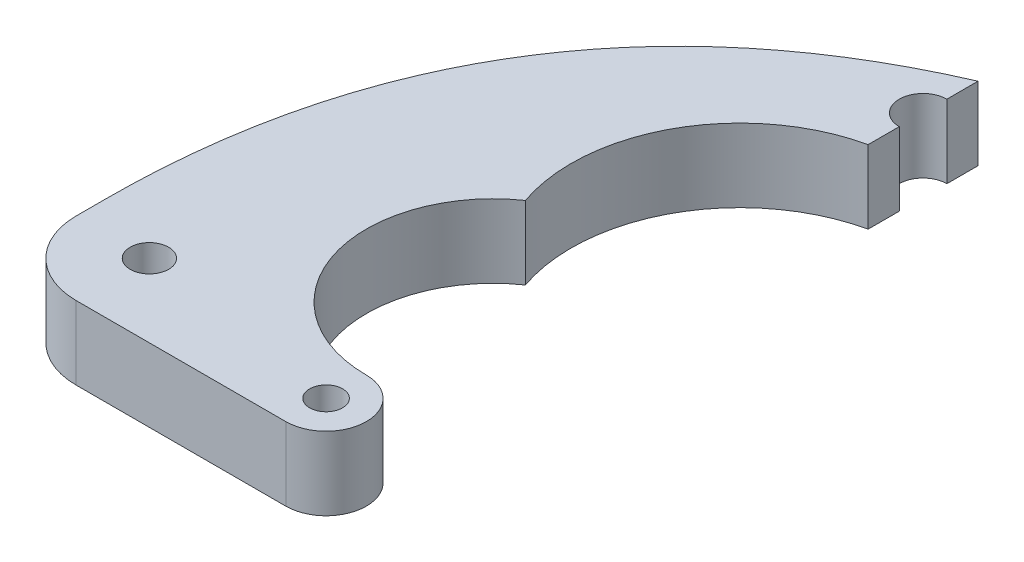
ISO-10303-21;
HEADER;
FILE_DESCRIPTION(('STEP AP214'),'2;1');
FILE_NAME('part.step','',(''),(''),'','','');
FILE_SCHEMA(('AUTOMOTIVE_DESIGN { 1 0 10303 214 1 1 1 1 }'));
ENDSEC;
DATA;
#1=APPLICATION_CONTEXT('core data for automotive mechanical design processes');
#2=APPLICATION_PROTOCOL_DEFINITION('international standard','automotive_design',2000,#1);
#3=PRODUCT_CONTEXT('',#1,'mechanical');
#4=PRODUCT('Part','Part','',(#3));
#5=PRODUCT_RELATED_PRODUCT_CATEGORY('part','',(#4));
#6=PRODUCT_DEFINITION_FORMATION('','',#4);
#7=PRODUCT_DEFINITION_CONTEXT('part definition',#1,'design');
#8=PRODUCT_DEFINITION('design','',#6,#7);
#9=PRODUCT_DEFINITION_SHAPE('','',#8);
#10=(LENGTH_UNIT() NAMED_UNIT(*) SI_UNIT(.MILLI.,.METRE.));
#11=(NAMED_UNIT(*) PLANE_ANGLE_UNIT() SI_UNIT($,.RADIAN.));
#12=(NAMED_UNIT(*) SI_UNIT($,.STERADIAN.) SOLID_ANGLE_UNIT());
#13=UNCERTAINTY_MEASURE_WITH_UNIT(LENGTH_MEASURE(1.E-05),#10,'distance_accuracy_value','');
#14=(GEOMETRIC_REPRESENTATION_CONTEXT(3) GLOBAL_UNCERTAINTY_ASSIGNED_CONTEXT((#13)) GLOBAL_UNIT_ASSIGNED_CONTEXT((#10,
#11,#12)) REPRESENTATION_CONTEXT('',''));
#15=CARTESIAN_POINT('',(0.,0.,0.));
#16=DIRECTION('',(0.,0.,1.));
#17=DIRECTION('',(1.,0.,0.));
#18=AXIS2_PLACEMENT_3D('',#15,#16,#17);
#19=CARTESIAN_POINT('',(0.,4.,-50.));
#20=DIRECTION('',(0.,1.,0.));
#21=DIRECTION('',(0.,0.,1.));
#22=AXIS2_PLACEMENT_3D('',#19,#20,#21);
#23=PLANE('',#22);
#24=CARTESIAN_POINT('',(-2.8,4.,-20.2));
#25=DIRECTION('',(0.,1.,0.));
#26=DIRECTION('',(0.,0.,1.));
#27=AXIS2_PLACEMENT_3D('',#24,#25,#26);
#28=CIRCLE('',#27,0.900000000000002);
#29=CARTESIAN_POINT('',(-2.8,4.,-19.3));
#30=VERTEX_POINT('',#29);
#31=EDGE_CURVE('E147',#30,#30,#28,.T.);
#32=ORIENTED_EDGE('',*,*,#31,.F.);
#33=EDGE_LOOP('',(#32));
#34=FACE_BOUND('',#33,.T.);
#35=CARTESIAN_POINT('',(0.,4.,-50.));
#36=DIRECTION('',(0.,-1.,0.));
#37=DIRECTION('',(0.,0.,1.));
#38=AXIS2_PLACEMENT_3D('',#35,#36,#37);
#39=CIRCLE('',#38,1.3);
#40=CARTESIAN_POINT('',(0.,4.,-48.7));
#41=VERTEX_POINT('',#40);
#42=CARTESIAN_POINT('',(0.,4.,-51.3));
#43=VERTEX_POINT('',#42);
#44=EDGE_CURVE('E167',#41,#43,#39,.T.);
#45=ORIENTED_EDGE('',*,*,#44,.T.);
#46=DIRECTION('',(0.,0.,-1.));
#47=VECTOR('',#46,1.);
#48=CARTESIAN_POINT('',(0.,4.,-51.3));
#49=LINE('',#48,#47);
#50=CARTESIAN_POINT('',(0.,4.,-53.));
#51=VERTEX_POINT('',#50);
#52=EDGE_CURVE('E100',#43,#51,#49,.T.);
#53=ORIENTED_EDGE('',*,*,#52,.T.);
#54=CARTESIAN_POINT('',(0.,4.,-53.));
#55=CARTESIAN_POINT('',(-11.2885860039401,4.,-48.1070694457853));
#56=CARTESIAN_POINT('',(-18.25,4.,-38.6912666099154));
#57=CARTESIAN_POINT('',(-18.25,4.,-23.6));
#58=B_SPLINE_CURVE_WITH_KNOTS('',3,(#54,#55,#56,#57),.UNSPECIFIED.,.F.,.F.,(4,4),(0.,1.),.UNSPECIFIED.);
#59=CARTESIAN_POINT('',(-18.25,4.,-23.6));
#60=VERTEX_POINT('',#59);
#61=EDGE_CURVE('E188',#51,#60,#58,.T.);
#62=ORIENTED_EDGE('',*,*,#61,.T.);
#63=DIRECTION('',(0.,0.,1.));
#64=VECTOR('',#63,1.);
#65=CARTESIAN_POINT('',(-18.25,4.,-23.6));
#66=LINE('',#65,#64);
#67=CARTESIAN_POINT('',(-18.25,4.,-22.));
#68=VERTEX_POINT('',#67);
#69=EDGE_CURVE('E207',#60,#68,#66,.T.);
#70=ORIENTED_EDGE('',*,*,#69,.T.);
#71=CARTESIAN_POINT('',(-14.25,4.,-22.));
#72=DIRECTION('',(0.,1.,0.));
#73=DIRECTION('',(0.,0.,1.));
#74=AXIS2_PLACEMENT_3D('',#71,#72,#73);
#75=CIRCLE('',#74,4.);
#76=CARTESIAN_POINT('',(-14.25,4.,-18.));
#77=VERTEX_POINT('',#76);
#78=EDGE_CURVE('E204',#68,#77,#75,.T.);
#79=ORIENTED_EDGE('',*,*,#78,.T.);
#80=DIRECTION('',(1.,0.,0.));
#81=VECTOR('',#80,1.);
#82=CARTESIAN_POINT('',(-14.25,4.,-18.));
#83=LINE('',#82,#81);
#84=CARTESIAN_POINT('',(-2.8,4.,-18.));
#85=VERTEX_POINT('',#84);
#86=EDGE_CURVE('E206',#77,#85,#83,.T.);
#87=ORIENTED_EDGE('',*,*,#86,.T.);
#88=CARTESIAN_POINT('',(-2.8,4.,-20.2));
#89=DIRECTION('',(0.,1.,0.));
#90=DIRECTION('',(0.,0.,1.));
#91=AXIS2_PLACEMENT_3D('',#88,#89,#90);
#92=CIRCLE('',#91,2.2);
#93=CARTESIAN_POINT('',(-2.8,4.,-22.4));
#94=VERTEX_POINT('',#93);
#95=EDGE_CURVE('E125',#85,#94,#92,.T.);
#96=ORIENTED_EDGE('',*,*,#95,.T.);
#97=CARTESIAN_POINT('',(-2.8,4.,-29.3090928684135));
#98=DIRECTION('',(0.,-1.,0.));
#99=DIRECTION('',(0.,0.,1.));
#100=AXIS2_PLACEMENT_3D('',#97,#98,#99);
#101=CIRCLE('',#100,6.90909286841346);
#102=CARTESIAN_POINT('',(-6.71779788708135,4.,-35.));
#103=VERTEX_POINT('',#102);
#104=EDGE_CURVE('E119',#94,#103,#101,.T.);
#105=ORIENTED_EDGE('',*,*,#104,.T.);
#106=CARTESIAN_POINT('',(2.,4.,-38.));
#107=DIRECTION('',(0.,-1.,0.));
#108=DIRECTION('',(0.,0.,1.));
#109=AXIS2_PLACEMENT_3D('',#106,#107,#108);
#110=CIRCLE('',#109,9.21954445729289);
#111=CARTESIAN_POINT('',(0.,4.,-47.));
#112=VERTEX_POINT('',#111);
#113=EDGE_CURVE('E123',#103,#112,#110,.T.);
#114=ORIENTED_EDGE('',*,*,#113,.T.);
#115=DIRECTION('',(0.,0.,-1.));
#116=VECTOR('',#115,1.);
#117=CARTESIAN_POINT('',(0.,4.,-47.));
#118=LINE('',#117,#116);
#119=EDGE_CURVE('E51',#112,#41,#118,.T.);
#120=ORIENTED_EDGE('',*,*,#119,.T.);
#121=EDGE_LOOP('',(#45,#53,#62,#70,#79,#87,#96,#105,#114,#120));
#122=FACE_BOUND('',#121,.T.);
#123=CARTESIAN_POINT('',(-14.25,4.,-22.));
#124=DIRECTION('',(0.,1.,0.));
#125=DIRECTION('',(0.,0.,1.));
#126=AXIS2_PLACEMENT_3D('',#123,#124,#125);
#127=CIRCLE('',#126,1.05);
#128=CARTESIAN_POINT('',(-14.25,4.,-20.95));
#129=VERTEX_POINT('',#128);
#130=EDGE_CURVE('E346',#129,#129,#127,.T.);
#131=ORIENTED_EDGE('',*,*,#130,.F.);
#132=EDGE_LOOP('',(#131));
#133=FACE_BOUND('',#132,.T.);
#134=ADVANCED_FACE('F34',(#34,#122,#133),#23,.T.);
#135=CARTESIAN_POINT('',(0.,0.,-50.));
#136=DIRECTION('',(0.,1.,0.));
#137=DIRECTION('',(0.,0.,1.));
#138=AXIS2_PLACEMENT_3D('',#135,#136,#137);
#139=PLANE('',#138);
#140=CARTESIAN_POINT('',(0.,0.,-50.));
#141=DIRECTION('',(0.,-1.,0.));
#142=DIRECTION('',(0.,0.,1.));
#143=AXIS2_PLACEMENT_3D('',#140,#141,#142);
#144=CIRCLE('',#143,1.3);
#145=CARTESIAN_POINT('',(0.,0.,-48.7));
#146=VERTEX_POINT('',#145);
#147=CARTESIAN_POINT('',(0.,0.,-51.3));
#148=VERTEX_POINT('',#147);
#149=EDGE_CURVE('E143',#146,#148,#144,.T.);
#150=ORIENTED_EDGE('',*,*,#149,.F.);
#151=DIRECTION('',(0.,0.,-1.));
#152=VECTOR('',#151,1.);
#153=CARTESIAN_POINT('',(0.,0.,-47.));
#154=LINE('',#153,#152);
#155=CARTESIAN_POINT('',(0.,0.,-47.));
#156=VERTEX_POINT('',#155);
#157=EDGE_CURVE('E92',#156,#146,#154,.T.);
#158=ORIENTED_EDGE('',*,*,#157,.F.);
#159=CARTESIAN_POINT('',(2.,0.,-38.));
#160=DIRECTION('',(0.,-1.,0.));
#161=DIRECTION('',(0.,0.,1.));
#162=AXIS2_PLACEMENT_3D('',#159,#160,#161);
#163=CIRCLE('',#162,9.21954445729289);
#164=CARTESIAN_POINT('',(-6.71779788708135,0.,-35.));
#165=VERTEX_POINT('',#164);
#166=EDGE_CURVE('E86',#165,#156,#163,.T.);
#167=ORIENTED_EDGE('',*,*,#166,.F.);
#168=CARTESIAN_POINT('',(-2.8,0.,-29.3090928684135));
#169=DIRECTION('',(0.,-1.,0.));
#170=DIRECTION('',(0.,0.,1.));
#171=AXIS2_PLACEMENT_3D('',#168,#169,#170);
#172=CIRCLE('',#171,6.90909286841346);
#173=CARTESIAN_POINT('',(-2.8,0.,-22.4));
#174=VERTEX_POINT('',#173);
#175=EDGE_CURVE('E133',#174,#165,#172,.T.);
#176=ORIENTED_EDGE('',*,*,#175,.F.);
#177=CARTESIAN_POINT('',(-2.8,0.,-20.2));
#178=DIRECTION('',(0.,1.,0.));
#179=DIRECTION('',(0.,0.,1.));
#180=AXIS2_PLACEMENT_3D('',#177,#178,#179);
#181=CIRCLE('',#180,2.2);
#182=CARTESIAN_POINT('',(-2.8,0.,-18.));
#183=VERTEX_POINT('',#182);
#184=EDGE_CURVE('E162',#183,#174,#181,.T.);
#185=ORIENTED_EDGE('',*,*,#184,.F.);
#186=DIRECTION('',(1.,0.,0.));
#187=VECTOR('',#186,1.);
#188=CARTESIAN_POINT('',(-14.25,0.,-18.));
#189=LINE('',#188,#187);
#190=CARTESIAN_POINT('',(-14.25,0.,-18.));
#191=VERTEX_POINT('',#190);
#192=EDGE_CURVE('E160',#191,#183,#189,.T.);
#193=ORIENTED_EDGE('',*,*,#192,.F.);
#194=CARTESIAN_POINT('',(-14.25,0.,-22.));
#195=DIRECTION('',(0.,1.,0.));
#196=DIRECTION('',(0.,0.,1.));
#197=AXIS2_PLACEMENT_3D('',#194,#195,#196);
#198=CIRCLE('',#197,4.);
#199=CARTESIAN_POINT('',(-18.25,0.,-22.));
#200=VERTEX_POINT('',#199);
#201=EDGE_CURVE('E158',#200,#191,#198,.T.);
#202=ORIENTED_EDGE('',*,*,#201,.F.);
#203=DIRECTION('',(0.,0.,1.));
#204=VECTOR('',#203,1.);
#205=CARTESIAN_POINT('',(-18.25,0.,-23.6));
#206=LINE('',#205,#204);
#207=CARTESIAN_POINT('',(-18.25,0.,-23.6));
#208=VERTEX_POINT('',#207);
#209=EDGE_CURVE('E153',#208,#200,#206,.T.);
#210=ORIENTED_EDGE('',*,*,#209,.F.);
#211=CARTESIAN_POINT('',(0.,0.,-53.));
#212=CARTESIAN_POINT('',(-11.2885860039401,0.,-48.1070694457853));
#213=CARTESIAN_POINT('',(-18.25,0.,-38.6912666099154));
#214=CARTESIAN_POINT('',(-18.25,0.,-23.6));
#215=B_SPLINE_CURVE_WITH_KNOTS('',3,(#211,#212,#213,#214),.UNSPECIFIED.,.F.,.F.,(4,4),(0.,1.),.UNSPECIFIED.);
#216=CARTESIAN_POINT('',(0.,0.,-53.));
#217=VERTEX_POINT('',#216);
#218=EDGE_CURVE('E149',#217,#208,#215,.T.);
#219=ORIENTED_EDGE('',*,*,#218,.F.);
#220=DIRECTION('',(0.,0.,-1.));
#221=VECTOR('',#220,1.);
#222=CARTESIAN_POINT('',(0.,0.,-51.3));
#223=LINE('',#222,#221);
#224=EDGE_CURVE('E146',#148,#217,#223,.T.);
#225=ORIENTED_EDGE('',*,*,#224,.F.);
#226=EDGE_LOOP('',(#150,#158,#167,#176,#185,#193,#202,#210,#219,#225));
#227=FACE_BOUND('',#226,.T.);
#228=CARTESIAN_POINT('',(-2.8,0.,-20.2));
#229=DIRECTION('',(0.,1.,0.));
#230=DIRECTION('',(0.,0.,1.));
#231=AXIS2_PLACEMENT_3D('',#228,#229,#230);
#232=CIRCLE('',#231,0.900000000000002);
#233=CARTESIAN_POINT('',(-2.8,0.,-19.3));
#234=VERTEX_POINT('',#233);
#235=EDGE_CURVE('E352',#234,#234,#232,.T.);
#236=ORIENTED_EDGE('',*,*,#235,.T.);
#237=EDGE_LOOP('',(#236));
#238=FACE_BOUND('',#237,.T.);
#239=CARTESIAN_POINT('',(-14.25,0.,-22.));
#240=DIRECTION('',(0.,1.,0.));
#241=DIRECTION('',(0.,0.,1.));
#242=AXIS2_PLACEMENT_3D('',#239,#240,#241);
#243=CIRCLE('',#242,1.05);
#244=CARTESIAN_POINT('',(-14.25,0.,-20.95));
#245=VERTEX_POINT('',#244);
#246=EDGE_CURVE('E349',#245,#245,#243,.T.);
#247=ORIENTED_EDGE('',*,*,#246,.T.);
#248=EDGE_LOOP('',(#247));
#249=FACE_BOUND('',#248,.T.);
#250=ADVANCED_FACE('F192',(#227,#238,#249),#139,.F.);
#251=CARTESIAN_POINT('',(0.,4.,-50.));
#252=DIRECTION('',(0.,-1.,0.));
#253=DIRECTION('',(0.,0.,-1.));
#254=AXIS2_PLACEMENT_3D('',#251,#252,#253);
#255=CYLINDRICAL_SURFACE('',#254,1.3);
#256=ORIENTED_EDGE('',*,*,#149,.T.);
#257=DIRECTION('',(0.,-1.,0.));
#258=VECTOR('',#257,1.);
#259=CARTESIAN_POINT('',(0.,4.,-51.3));
#260=LINE('',#259,#258);
#261=EDGE_CURVE('E11',#43,#148,#260,.T.);
#262=ORIENTED_EDGE('',*,*,#261,.F.);
#263=ORIENTED_EDGE('',*,*,#44,.F.);
#264=DIRECTION('',(0.,-1.,0.));
#265=VECTOR('',#264,1.);
#266=CARTESIAN_POINT('',(0.,4.,-48.7));
#267=LINE('',#266,#265);
#268=EDGE_CURVE('E139',#41,#146,#267,.T.);
#269=ORIENTED_EDGE('',*,*,#268,.T.);
#270=EDGE_LOOP('',(#256,#262,#263,#269));
#271=FACE_BOUND('',#270,.T.);
#272=ADVANCED_FACE('F36',(#271),#255,.F.);
#273=CARTESIAN_POINT('',(0.,4.,-51.3));
#274=DIRECTION('',(-1.,0.,0.));
#275=DIRECTION('',(0.,0.,1.));
#276=AXIS2_PLACEMENT_3D('',#273,#274,#275);
#277=PLANE('',#276);
#278=ORIENTED_EDGE('',*,*,#224,.T.);
#279=DIRECTION('',(0.,-1.,0.));
#280=VECTOR('',#279,1.);
#281=CARTESIAN_POINT('',(0.,4.,-53.));
#282=LINE('',#281,#280);
#283=EDGE_CURVE('E43',#51,#217,#282,.T.);
#284=ORIENTED_EDGE('',*,*,#283,.F.);
#285=ORIENTED_EDGE('',*,*,#52,.F.);
#286=ORIENTED_EDGE('',*,*,#261,.T.);
#287=EDGE_LOOP('',(#278,#284,#285,#286));
#288=FACE_BOUND('',#287,.T.);
#289=ADVANCED_FACE('F223',(#288),#277,.F.);
#290=DIRECTION('',(0.,-1.,0.));
#291=VECTOR('',#290,1.);
#292=SURFACE_OF_LINEAR_EXTRUSION('',#58,#291);
#293=ORIENTED_EDGE('',*,*,#218,.T.);
#294=DIRECTION('',(0.,-1.,0.));
#295=VECTOR('',#294,1.);
#296=CARTESIAN_POINT('',(-18.25,4.,-23.6));
#297=LINE('',#296,#295);
#298=EDGE_CURVE('E180',#60,#208,#297,.T.);
#299=ORIENTED_EDGE('',*,*,#298,.F.);
#300=ORIENTED_EDGE('',*,*,#61,.F.);
#301=ORIENTED_EDGE('',*,*,#283,.T.);
#302=EDGE_LOOP('',(#293,#299,#300,#301));
#303=FACE_BOUND('',#302,.T.);
#304=ADVANCED_FACE('F186',(#303),#292,.F.);
#305=CARTESIAN_POINT('',(-18.25,4.,-23.6));
#306=DIRECTION('',(1.,0.,0.));
#307=DIRECTION('',(0.,0.,-1.));
#308=AXIS2_PLACEMENT_3D('',#305,#306,#307);
#309=PLANE('',#308);
#310=ORIENTED_EDGE('',*,*,#209,.T.);
#311=DIRECTION('',(0.,-1.,0.));
#312=VECTOR('',#311,1.);
#313=CARTESIAN_POINT('',(-18.25,4.,-22.));
#314=LINE('',#313,#312);
#315=EDGE_CURVE('E177',#68,#200,#314,.T.);
#316=ORIENTED_EDGE('',*,*,#315,.F.);
#317=ORIENTED_EDGE('',*,*,#69,.F.);
#318=ORIENTED_EDGE('',*,*,#298,.T.);
#319=EDGE_LOOP('',(#310,#316,#317,#318));
#320=FACE_BOUND('',#319,.T.);
#321=ADVANCED_FACE('F198',(#320),#309,.F.);
#322=CARTESIAN_POINT('',(-14.25,4.,-22.));
#323=DIRECTION('',(0.,-1.,0.));
#324=DIRECTION('',(0.,0.,-1.));
#325=AXIS2_PLACEMENT_3D('',#322,#323,#324);
#326=CYLINDRICAL_SURFACE('',#325,4.);
#327=ORIENTED_EDGE('',*,*,#201,.T.);
#328=DIRECTION('',(0.,-1.,0.));
#329=VECTOR('',#328,1.);
#330=CARTESIAN_POINT('',(-14.25,4.,-18.));
#331=LINE('',#330,#329);
#332=EDGE_CURVE('E174',#77,#191,#331,.T.);
#333=ORIENTED_EDGE('',*,*,#332,.F.);
#334=ORIENTED_EDGE('',*,*,#78,.F.);
#335=ORIENTED_EDGE('',*,*,#315,.T.);
#336=EDGE_LOOP('',(#327,#333,#334,#335));
#337=FACE_BOUND('',#336,.T.);
#338=ADVANCED_FACE('F202',(#337),#326,.T.);
#339=CARTESIAN_POINT('',(-14.25,4.,-18.));
#340=DIRECTION('',(0.,0.,-1.));
#341=DIRECTION('',(-1.,0.,0.));
#342=AXIS2_PLACEMENT_3D('',#339,#340,#341);
#343=PLANE('',#342);
#344=ORIENTED_EDGE('',*,*,#192,.T.);
#345=DIRECTION('',(0.,-1.,0.));
#346=VECTOR('',#345,1.);
#347=CARTESIAN_POINT('',(-2.8,4.,-18.));
#348=LINE('',#347,#346);
#349=EDGE_CURVE('E171',#85,#183,#348,.T.);
#350=ORIENTED_EDGE('',*,*,#349,.F.);
#351=ORIENTED_EDGE('',*,*,#86,.F.);
#352=ORIENTED_EDGE('',*,*,#332,.T.);
#353=EDGE_LOOP('',(#344,#350,#351,#352));
#354=FACE_BOUND('',#353,.T.);
#355=ADVANCED_FACE('F252',(#354),#343,.F.);
#356=CARTESIAN_POINT('',(-2.8,4.,-20.2));
#357=DIRECTION('',(0.,-1.,0.));
#358=DIRECTION('',(0.,0.,-1.));
#359=AXIS2_PLACEMENT_3D('',#356,#357,#358);
#360=CYLINDRICAL_SURFACE('',#359,2.2);
#361=ORIENTED_EDGE('',*,*,#184,.T.);
#362=DIRECTION('',(0.,-1.,0.));
#363=VECTOR('',#362,1.);
#364=CARTESIAN_POINT('',(-2.8,4.,-22.4));
#365=LINE('',#364,#363);
#366=EDGE_CURVE('E134',#94,#174,#365,.T.);
#367=ORIENTED_EDGE('',*,*,#366,.F.);
#368=ORIENTED_EDGE('',*,*,#95,.F.);
#369=ORIENTED_EDGE('',*,*,#349,.T.);
#370=EDGE_LOOP('',(#361,#367,#368,#369));
#371=FACE_BOUND('',#370,.T.);
#372=ADVANCED_FACE('F249',(#371),#360,.T.);
#373=CARTESIAN_POINT('',(-2.8,4.,-29.3090928684135));
#374=DIRECTION('',(0.,-1.,0.));
#375=DIRECTION('',(0.,0.,-1.));
#376=AXIS2_PLACEMENT_3D('',#373,#374,#375);
#377=CYLINDRICAL_SURFACE('',#376,6.90909286841346);
#378=ORIENTED_EDGE('',*,*,#175,.T.);
#379=DIRECTION('',(0.,-1.,0.));
#380=VECTOR('',#379,1.);
#381=CARTESIAN_POINT('',(-6.71779788708135,4.,-35.));
#382=LINE('',#381,#380);
#383=EDGE_CURVE('E130',#103,#165,#382,.T.);
#384=ORIENTED_EDGE('',*,*,#383,.F.);
#385=ORIENTED_EDGE('',*,*,#104,.F.);
#386=ORIENTED_EDGE('',*,*,#366,.T.);
#387=EDGE_LOOP('',(#378,#384,#385,#386));
#388=FACE_BOUND('',#387,.T.);
#389=ADVANCED_FACE('F131',(#388),#377,.F.);
#390=CARTESIAN_POINT('',(2.,4.,-38.));
#391=DIRECTION('',(0.,-1.,0.));
#392=DIRECTION('',(0.,0.,-1.));
#393=AXIS2_PLACEMENT_3D('',#390,#391,#392);
#394=CYLINDRICAL_SURFACE('',#393,9.21954445729289);
#395=ORIENTED_EDGE('',*,*,#166,.T.);
#396=DIRECTION('',(0.,-1.,0.));
#397=VECTOR('',#396,1.);
#398=CARTESIAN_POINT('',(0.,4.,-47.));
#399=LINE('',#398,#397);
#400=EDGE_CURVE('E135',#112,#156,#399,.T.);
#401=ORIENTED_EDGE('',*,*,#400,.F.);
#402=ORIENTED_EDGE('',*,*,#113,.F.);
#403=ORIENTED_EDGE('',*,*,#383,.T.);
#404=EDGE_LOOP('',(#395,#401,#402,#403));
#405=FACE_BOUND('',#404,.T.);
#406=ADVANCED_FACE('F137',(#405),#394,.F.);
#407=CARTESIAN_POINT('',(0.,4.,-47.));
#408=DIRECTION('',(-1.,0.,0.));
#409=DIRECTION('',(0.,0.,1.));
#410=AXIS2_PLACEMENT_3D('',#407,#408,#409);
#411=PLANE('',#410);
#412=ORIENTED_EDGE('',*,*,#157,.T.);
#413=ORIENTED_EDGE('',*,*,#268,.F.);
#414=ORIENTED_EDGE('',*,*,#119,.F.);
#415=ORIENTED_EDGE('',*,*,#400,.T.);
#416=EDGE_LOOP('',(#412,#413,#414,#415));
#417=FACE_BOUND('',#416,.T.);
#418=ADVANCED_FACE('F242',(#417),#411,.F.);
#419=CARTESIAN_POINT('',(-2.8,4.,-20.2));
#420=DIRECTION('',(0.,-1.,0.));
#421=DIRECTION('',(0.,0.,-1.));
#422=AXIS2_PLACEMENT_3D('',#419,#420,#421);
#423=CYLINDRICAL_SURFACE('',#422,0.900000000000002);
#424=ORIENTED_EDGE('',*,*,#31,.T.);
#425=EDGE_LOOP('',(#424));
#426=FACE_BOUND('',#425,.T.);
#427=ORIENTED_EDGE('',*,*,#235,.F.);
#428=EDGE_LOOP('',(#427));
#429=FACE_BOUND('',#428,.T.);
#430=ADVANCED_FACE('F239',(#426,#429),#423,.F.);
#431=CARTESIAN_POINT('',(-14.25,4.,-22.));
#432=DIRECTION('',(0.,-1.,0.));
#433=DIRECTION('',(0.,0.,-1.));
#434=AXIS2_PLACEMENT_3D('',#431,#432,#433);
#435=CYLINDRICAL_SURFACE('',#434,1.05);
#436=ORIENTED_EDGE('',*,*,#130,.T.);
#437=EDGE_LOOP('',(#436));
#438=FACE_BOUND('',#437,.T.);
#439=ORIENTED_EDGE('',*,*,#246,.F.);
#440=EDGE_LOOP('',(#439));
#441=FACE_BOUND('',#440,.T.);
#442=ADVANCED_FACE('F327',(#438,#441),#435,.F.);
#443=CLOSED_SHELL('',(#134,#250,#272,#289,#304,#321,#338,#355,#372,#389,#406,#418,#430,#442));
#444=MANIFOLD_SOLID_BREP('B2',#443);
#445=ADVANCED_BREP_SHAPE_REPRESENTATION('',(#18,#444),#14);
#446=SHAPE_DEFINITION_REPRESENTATION(#9,#445);
ENDSEC;
END-ISO-10303-21;
